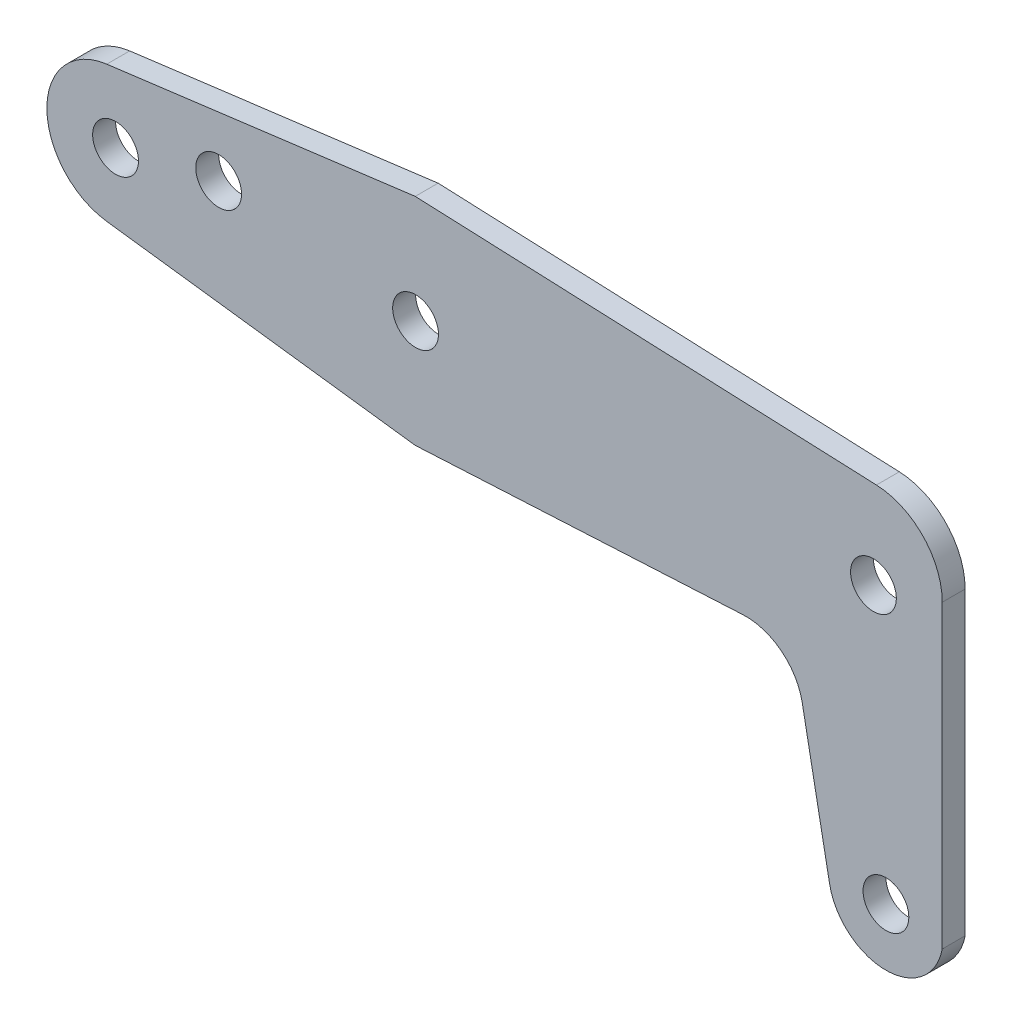
ISO-10303-21;
HEADER;
FILE_DESCRIPTION(('STEP AP214'),'2;1');
FILE_NAME('part.step','',(''),(''),'','','');
FILE_SCHEMA(('AUTOMOTIVE_DESIGN { 1 0 10303 214 1 1 1 1 }'));
ENDSEC;
DATA;
#1=APPLICATION_CONTEXT('core data for automotive mechanical design processes');
#2=APPLICATION_PROTOCOL_DEFINITION('international standard','automotive_design',2000,#1);
#3=PRODUCT_CONTEXT('',#1,'mechanical');
#4=PRODUCT('Part','Part','',(#3));
#5=PRODUCT_RELATED_PRODUCT_CATEGORY('part','',(#4));
#6=PRODUCT_DEFINITION_FORMATION('','',#4);
#7=PRODUCT_DEFINITION_CONTEXT('part definition',#1,'design');
#8=PRODUCT_DEFINITION('design','',#6,#7);
#9=PRODUCT_DEFINITION_SHAPE('','',#8);
#10=(LENGTH_UNIT() NAMED_UNIT(*) SI_UNIT(.MILLI.,.METRE.));
#11=(NAMED_UNIT(*) PLANE_ANGLE_UNIT() SI_UNIT($,.RADIAN.));
#12=(NAMED_UNIT(*) SI_UNIT($,.STERADIAN.) SOLID_ANGLE_UNIT());
#13=UNCERTAINTY_MEASURE_WITH_UNIT(LENGTH_MEASURE(1.E-05),#10,'distance_accuracy_value','');
#14=(GEOMETRIC_REPRESENTATION_CONTEXT(3) GLOBAL_UNCERTAINTY_ASSIGNED_CONTEXT((#13)) GLOBAL_UNIT_ASSIGNED_CONTEXT((#10,
#11,#12)) REPRESENTATION_CONTEXT('',''));
#15=CARTESIAN_POINT('',(0.,0.,0.));
#16=DIRECTION('',(0.,0.,1.));
#17=DIRECTION('',(1.,0.,0.));
#18=AXIS2_PLACEMENT_3D('',#15,#16,#17);
#19=CARTESIAN_POINT('',(-41.6068780105601,0.,3.175));
#20=DIRECTION('',(0.,0.,-1.));
#21=DIRECTION('',(-1.,0.,0.));
#22=AXIS2_PLACEMENT_3D('',#19,#20,#21);
#23=CYLINDRICAL_SURFACE('',#22,9.525);
#24=CARTESIAN_POINT('',(-41.6068780105601,0.,0.));
#25=DIRECTION('',(0.,0.,1.));
#26=DIRECTION('',(1.,0.,0.));
#27=AXIS2_PLACEMENT_3D('',#24,#25,#26);
#28=CIRCLE('',#27,9.525);
#29=CARTESIAN_POINT('',(-42.823231979609,9.44701582627969,0.));
#30=VERTEX_POINT('',#29);
#31=CARTESIAN_POINT('',(-42.823231979609,-9.4470158262797,0.));
#32=VERTEX_POINT('',#31);
#33=EDGE_CURVE('E156',#30,#32,#28,.T.);
#34=ORIENTED_EDGE('',*,*,#33,.T.);
#35=DIRECTION('',(0.,0.,-1.));
#36=VECTOR('',#35,1.);
#37=CARTESIAN_POINT('',(-42.823231979609,-9.4470158262797,3.175));
#38=LINE('',#37,#36);
#39=CARTESIAN_POINT('',(-42.823231979609,-9.4470158262797,3.175));
#40=VERTEX_POINT('',#39);
#41=EDGE_CURVE('E11',#40,#32,#38,.T.);
#42=ORIENTED_EDGE('',*,*,#41,.F.);
#43=CARTESIAN_POINT('',(-41.6068780105601,0.,3.175));
#44=DIRECTION('',(0.,0.,1.));
#45=DIRECTION('',(1.,0.,0.));
#46=AXIS2_PLACEMENT_3D('',#43,#44,#45);
#47=CIRCLE('',#46,9.525);
#48=CARTESIAN_POINT('',(-42.823231979609,9.44701582627969,3.175));
#49=VERTEX_POINT('',#48);
#50=EDGE_CURVE('E185',#49,#40,#47,.T.);
#51=ORIENTED_EDGE('',*,*,#50,.F.);
#52=DIRECTION('',(0.,0.,-1.));
#53=VECTOR('',#52,1.);
#54=CARTESIAN_POINT('',(-42.823231979609,9.44701582627969,3.175));
#55=LINE('',#54,#53);
#56=EDGE_CURVE('E152',#49,#30,#55,.T.);
#57=ORIENTED_EDGE('',*,*,#56,.T.);
#58=EDGE_LOOP('',(#34,#42,#51,#57));
#59=FACE_BOUND('',#58,.T.);
#60=ADVANCED_FACE('F43',(#59),#23,.T.);
#61=CARTESIAN_POINT('',(-42.823231979609,-9.4470158262797,3.175));
#62=DIRECTION('',(0.127701204099621,0.991812685173721,0.));
#63=DIRECTION('',(-0.991812685173721,0.127701204099621,0.));
#64=AXIS2_PLACEMENT_3D('',#61,#62,#63);
#65=PLANE('',#64);
#66=DIRECTION('',(0.991812685173721,-0.127701204099621,0.));
#67=VECTOR('',#66,1.);
#68=CARTESIAN_POINT('',(-42.823231979609,-9.4470158262797,0.));
#69=LINE('',#68,#67);
#70=CARTESIAN_POINT('',(-0.0462491693048968,-14.9547818533575,0.));
#71=VERTEX_POINT('',#70);
#72=EDGE_CURVE('E160',#32,#71,#69,.T.);
#73=ORIENTED_EDGE('',*,*,#72,.T.);
#74=DIRECTION('',(0.,0.,-1.));
#75=VECTOR('',#74,1.);
#76=CARTESIAN_POINT('',(-0.0462491693048968,-14.9547818533575,3.175));
#77=LINE('',#76,#75);
#78=CARTESIAN_POINT('',(-0.0462491693048968,-14.9547818533575,3.175));
#79=VERTEX_POINT('',#78);
#80=EDGE_CURVE('E52',#79,#71,#77,.T.);
#81=ORIENTED_EDGE('',*,*,#80,.F.);
#82=DIRECTION('',(0.991812685173721,-0.127701204099621,0.));
#83=VECTOR('',#82,1.);
#84=CARTESIAN_POINT('',(-42.823231979609,-9.4470158262797,3.175));
#85=LINE('',#84,#83);
#86=EDGE_CURVE('E109',#40,#79,#85,.T.);
#87=ORIENTED_EDGE('',*,*,#86,.F.);
#88=ORIENTED_EDGE('',*,*,#41,.T.);
#89=EDGE_LOOP('',(#73,#81,#87,#88));
#90=FACE_BOUND('',#89,.T.);
#91=ADVANCED_FACE('F323',(#90),#65,.F.);
#92=CARTESIAN_POINT('',(-0.0462491693048968,-14.9547818533575,3.175));
#93=DIRECTION('',(-0.0525125452653519,0.998620264459797,0.));
#94=DIRECTION('',(-0.998620264459797,-0.0525125452653519,0.));
#95=AXIS2_PLACEMENT_3D('',#92,#93,#94);
#96=PLANE('',#95);
#97=DIRECTION('',(0.998620264459797,0.0525125452653519,0.));
#98=VECTOR('',#97,1.);
#99=CARTESIAN_POINT('',(-0.0462491693048968,-14.9547818533575,0.));
#100=LINE('',#99,#98);
#101=CARTESIAN_POINT('',(45.3983126657175,-12.5650750795653,0.));
#102=VERTEX_POINT('',#101);
#103=EDGE_CURVE('E164',#71,#102,#100,.T.);
#104=ORIENTED_EDGE('',*,*,#103,.T.);
#105=DIRECTION('',(0.,0.,-1.));
#106=VECTOR('',#105,1.);
#107=CARTESIAN_POINT('',(45.3983126657175,-12.5650750795653,3.175));
#108=LINE('',#107,#106);
#109=CARTESIAN_POINT('',(45.3983126657175,-12.5650750795653,3.175));
#110=VERTEX_POINT('',#109);
#111=EDGE_CURVE('E204',#110,#102,#108,.T.);
#112=ORIENTED_EDGE('',*,*,#111,.F.);
#113=DIRECTION('',(0.998620264459797,0.0525125452653519,0.));
#114=VECTOR('',#113,1.);
#115=CARTESIAN_POINT('',(-0.0462491693048968,-14.9547818533575,3.175));
#116=LINE('',#115,#114);
#117=EDGE_CURVE('E214',#79,#110,#116,.T.);
#118=ORIENTED_EDGE('',*,*,#117,.F.);
#119=ORIENTED_EDGE('',*,*,#80,.T.);
#120=EDGE_LOOP('',(#104,#112,#118,#119));
#121=FACE_BOUND('',#120,.T.);
#122=ADVANCED_FACE('F212',(#121),#96,.F.);
#123=CARTESIAN_POINT('',(45.8157979030861,-20.5043059060736,3.175));
#124=DIRECTION('',(0.,0.,-1.));
#125=DIRECTION('',(-1.,0.,0.));
#126=AXIS2_PLACEMENT_3D('',#123,#124,#125);
#127=CYLINDRICAL_SURFACE('',#126,7.9502);
#128=CARTESIAN_POINT('',(45.8157979030861,-20.5043059060736,0.));
#129=DIRECTION('',(0.,0.,-1.));
#130=DIRECTION('',(-1.,0.,0.));
#131=AXIS2_PLACEMENT_3D('',#128,#129,#130);
#132=CIRCLE('',#131,7.9502);
#133=CARTESIAN_POINT('',(53.6248359675925,-19.0127950790625,0.));
#134=VERTEX_POINT('',#133);
#135=EDGE_CURVE('E167',#102,#134,#132,.T.);
#136=ORIENTED_EDGE('',*,*,#135,.T.);
#137=DIRECTION('',(0.,0.,-1.));
#138=VECTOR('',#137,1.);
#139=CARTESIAN_POINT('',(53.6248359675925,-19.0127950790625,3.175));
#140=LINE('',#139,#138);
#141=CARTESIAN_POINT('',(53.6248359675925,-19.0127950790625,3.175));
#142=VERTEX_POINT('',#141);
#143=EDGE_CURVE('E200',#142,#134,#140,.T.);
#144=ORIENTED_EDGE('',*,*,#143,.F.);
#145=CARTESIAN_POINT('',(45.8157979030861,-20.5043059060736,3.175));
#146=DIRECTION('',(0.,0.,-1.));
#147=DIRECTION('',(-1.,0.,0.));
#148=AXIS2_PLACEMENT_3D('',#145,#146,#147);
#149=CIRCLE('',#148,7.9502);
#150=EDGE_CURVE('E233',#110,#142,#149,.T.);
#151=ORIENTED_EDGE('',*,*,#150,.F.);
#152=ORIENTED_EDGE('',*,*,#111,.T.);
#153=EDGE_LOOP('',(#136,#144,#151,#152));
#154=FACE_BOUND('',#153,.T.);
#155=ADVANCED_FACE('F223',(#154),#127,.F.);
#156=CARTESIAN_POINT('',(53.6248359675925,-19.0127950790625,3.175));
#157=DIRECTION('',(0.982244228384986,0.187606705115735,0.));
#158=DIRECTION('',(-0.187606705115735,0.982244228384987,0.));
#159=AXIS2_PLACEMENT_3D('',#156,#157,#158);
#160=PLANE('',#159);
#161=DIRECTION('',(0.187606705115735,-0.982244228384986,0.));
#162=VECTOR('',#161,1.);
#163=CARTESIAN_POINT('',(53.6248359675925,-19.0127950790625,0.));
#164=LINE('',#163,#162);
#165=CARTESIAN_POINT('',(57.4220964213346,-38.8939457131071,0.));
#166=VERTEX_POINT('',#165);
#167=EDGE_CURVE('E170',#134,#166,#164,.T.);
#168=ORIENTED_EDGE('',*,*,#167,.T.);
#169=DIRECTION('',(0.,0.,-1.));
#170=VECTOR('',#169,1.);
#171=CARTESIAN_POINT('',(57.4220964213346,-38.8939457131071,3.175));
#172=LINE('',#171,#170);
#173=CARTESIAN_POINT('',(57.4220964213346,-38.8939457131071,3.175));
#174=VERTEX_POINT('',#173);
#175=EDGE_CURVE('E196',#174,#166,#172,.T.);
#176=ORIENTED_EDGE('',*,*,#175,.F.);
#177=DIRECTION('',(0.187606705115735,-0.982244228384986,0.));
#178=VECTOR('',#177,1.);
#179=CARTESIAN_POINT('',(53.6248359675925,-19.0127950790625,3.175));
#180=LINE('',#179,#178);
#181=EDGE_CURVE('E229',#142,#174,#180,.T.);
#182=ORIENTED_EDGE('',*,*,#181,.F.);
#183=ORIENTED_EDGE('',*,*,#143,.T.);
#184=EDGE_LOOP('',(#168,#176,#182,#183));
#185=FACE_BOUND('',#184,.T.);
#186=ADVANCED_FACE('F227',(#185),#160,.F.);
#187=CARTESIAN_POINT('',(65.2311344858409,-37.402434886096,3.175));
#188=DIRECTION('',(0.,0.,-1.));
#189=DIRECTION('',(-1.,0.,0.));
#190=AXIS2_PLACEMENT_3D('',#187,#188,#189);
#191=CYLINDRICAL_SURFACE('',#190,7.9502);
#192=CARTESIAN_POINT('',(65.2311344858409,-37.402434886096,0.));
#193=DIRECTION('',(0.,0.,1.));
#194=DIRECTION('',(1.,0.,0.));
#195=AXIS2_PLACEMENT_3D('',#192,#193,#194);
#196=CIRCLE('',#195,7.9502);
#197=CARTESIAN_POINT('',(73.0401725503472,-38.8939457131071,0.));
#198=VERTEX_POINT('',#197);
#199=EDGE_CURVE('E173',#166,#198,#196,.T.);
#200=ORIENTED_EDGE('',*,*,#199,.T.);
#201=DIRECTION('',(0.,0.,-1.));
#202=VECTOR('',#201,1.);
#203=CARTESIAN_POINT('',(73.0401725503472,-38.8939457131071,3.175));
#204=LINE('',#203,#202);
#205=CARTESIAN_POINT('',(73.0401725503472,-38.8939457131071,3.175));
#206=VERTEX_POINT('',#205);
#207=EDGE_CURVE('E192',#206,#198,#204,.T.);
#208=ORIENTED_EDGE('',*,*,#207,.F.);
#209=CARTESIAN_POINT('',(65.2311344858409,-37.402434886096,3.175));
#210=DIRECTION('',(0.,0.,1.));
#211=DIRECTION('',(1.,0.,0.));
#212=AXIS2_PLACEMENT_3D('',#209,#210,#211);
#213=CIRCLE('',#212,7.9502);
#214=EDGE_CURVE('E232',#174,#206,#213,.T.);
#215=ORIENTED_EDGE('',*,*,#214,.F.);
#216=ORIENTED_EDGE('',*,*,#175,.T.);
#217=EDGE_LOOP('',(#200,#208,#215,#216));
#218=FACE_BOUND('',#217,.T.);
#219=ADVANCED_FACE('F335',(#218),#191,.T.);
#220=CARTESIAN_POINT('',(73.0401725503472,-38.8939457131071,3.175));
#221=DIRECTION('',(-1.,0.,0.));
#222=DIRECTION('',(0.,0.,1.));
#223=AXIS2_PLACEMENT_3D('',#220,#221,#222);
#224=PLANE('',#223);
#225=DIRECTION('',(0.,1.,0.));
#226=VECTOR('',#225,1.);
#227=CARTESIAN_POINT('',(73.0401725503472,-38.8939457131071,0.));
#228=LINE('',#227,#226);
#229=CARTESIAN_POINT('',(73.0401725503472,2.75262483710328,0.));
#230=VERTEX_POINT('',#229);
#231=EDGE_CURVE('E176',#198,#230,#228,.T.);
#232=ORIENTED_EDGE('',*,*,#231,.T.);
#233=DIRECTION('',(0.,0.,-1.));
#234=VECTOR('',#233,1.);
#235=CARTESIAN_POINT('',(73.0401725503472,2.75262483710328,3.175));
#236=LINE('',#235,#234);
#237=CARTESIAN_POINT('',(73.0401725503472,2.75262483710328,3.175));
#238=VERTEX_POINT('',#237);
#239=EDGE_CURVE('E145',#238,#230,#236,.T.);
#240=ORIENTED_EDGE('',*,*,#239,.F.);
#241=DIRECTION('',(0.,1.,0.));
#242=VECTOR('',#241,1.);
#243=CARTESIAN_POINT('',(73.0401725503472,-38.8939457131071,3.175));
#244=LINE('',#243,#242);
#245=EDGE_CURVE('E134',#206,#238,#244,.T.);
#246=ORIENTED_EDGE('',*,*,#245,.F.);
#247=ORIENTED_EDGE('',*,*,#207,.T.);
#248=EDGE_LOOP('',(#232,#240,#246,#247));
#249=FACE_BOUND('',#248,.T.);
#250=ADVANCED_FACE('F332',(#249),#224,.F.);
#251=CARTESIAN_POINT('',(63.5151725503472,2.75262483710327,3.175));
#252=DIRECTION('',(0.,0.,-1.));
#253=DIRECTION('',(-1.,0.,0.));
#254=AXIS2_PLACEMENT_3D('',#251,#252,#253);
#255=CYLINDRICAL_SURFACE('',#254,9.525);
#256=CARTESIAN_POINT('',(63.5151725503472,2.75262483710327,0.));
#257=DIRECTION('',(0.,0.,1.));
#258=DIRECTION('',(-1.,0.,0.));
#259=AXIS2_PLACEMENT_3D('',#256,#257,#258);
#260=CIRCLE('',#259,9.525);
#261=CARTESIAN_POINT('',(63.9147483747233,12.2692400000997,0.));
#262=VERTEX_POINT('',#261);
#263=EDGE_CURVE('E143',#230,#262,#260,.T.);
#264=ORIENTED_EDGE('',*,*,#263,.T.);
#265=DIRECTION('',(0.,0.,-1.));
#266=VECTOR('',#265,1.);
#267=CARTESIAN_POINT('',(63.9147483747233,12.2692400000997,3.175));
#268=LINE('',#267,#266);
#269=CARTESIAN_POINT('',(63.9147483747233,12.2692400000997,3.175));
#270=VERTEX_POINT('',#269);
#271=EDGE_CURVE('E140',#270,#262,#268,.T.);
#272=ORIENTED_EDGE('',*,*,#271,.F.);
#273=CARTESIAN_POINT('',(63.5151725503472,2.75262483710327,3.175));
#274=DIRECTION('',(0.,0.,1.));
#275=DIRECTION('',(-1.,0.,0.));
#276=AXIS2_PLACEMENT_3D('',#273,#274,#275);
#277=CIRCLE('',#276,9.525);
#278=EDGE_CURVE('E128',#238,#270,#277,.T.);
#279=ORIENTED_EDGE('',*,*,#278,.F.);
#280=ORIENTED_EDGE('',*,*,#239,.T.);
#281=EDGE_LOOP('',(#264,#272,#279,#280));
#282=FACE_BOUND('',#281,.T.);
#283=ADVANCED_FACE('F141',(#282),#255,.T.);
#284=CARTESIAN_POINT('',(-0.0462491693049005,14.9547818533575,3.175));
#285=DIRECTION('',(-0.0419502177822702,-0.999119702151859,0.));
#286=DIRECTION('',(0.99911970215186,-0.0419502177822702,0.));
#287=AXIS2_PLACEMENT_3D('',#284,#285,#286);
#288=PLANE('',#287);
#289=DIRECTION('',(-0.999119702151859,0.0419502177822702,0.));
#290=VECTOR('',#289,1.);
#291=CARTESIAN_POINT('',(-0.0462491693049005,14.9547818533575,0.));
#292=LINE('',#291,#290);
#293=CARTESIAN_POINT('',(-0.0462491693049005,14.9547818533575,0.));
#294=VERTEX_POINT('',#293);
#295=EDGE_CURVE('E95',#262,#294,#292,.T.);
#296=ORIENTED_EDGE('',*,*,#295,.T.);
#297=DIRECTION('',(0.,0.,-1.));
#298=VECTOR('',#297,1.);
#299=CARTESIAN_POINT('',(-0.0462491693049005,14.9547818533575,3.175));
#300=LINE('',#299,#298);
#301=CARTESIAN_POINT('',(-0.0462491693049005,14.9547818533575,3.175));
#302=VERTEX_POINT('',#301);
#303=EDGE_CURVE('E146',#302,#294,#300,.T.);
#304=ORIENTED_EDGE('',*,*,#303,.F.);
#305=DIRECTION('',(-0.999119702151859,0.0419502177822702,0.));
#306=VECTOR('',#305,1.);
#307=CARTESIAN_POINT('',(-0.0462491693049005,14.9547818533575,3.175));
#308=LINE('',#307,#306);
#309=EDGE_CURVE('E132',#270,#302,#308,.T.);
#310=ORIENTED_EDGE('',*,*,#309,.F.);
#311=ORIENTED_EDGE('',*,*,#271,.T.);
#312=EDGE_LOOP('',(#296,#304,#310,#311));
#313=FACE_BOUND('',#312,.T.);
#314=ADVANCED_FACE('F148',(#313),#288,.F.);
#315=CARTESIAN_POINT('',(-42.823231979609,9.44701582627969,3.175));
#316=DIRECTION('',(0.127701204099621,-0.991812685173721,0.));
#317=DIRECTION('',(0.991812685173721,0.127701204099621,0.));
#318=AXIS2_PLACEMENT_3D('',#315,#316,#317);
#319=PLANE('',#318);
#320=DIRECTION('',(-0.991812685173721,-0.127701204099621,0.));
#321=VECTOR('',#320,1.);
#322=CARTESIAN_POINT('',(-42.823231979609,9.44701582627969,0.));
#323=LINE('',#322,#321);
#324=EDGE_CURVE('E101',#294,#30,#323,.T.);
#325=ORIENTED_EDGE('',*,*,#324,.T.);
#326=ORIENTED_EDGE('',*,*,#56,.F.);
#327=DIRECTION('',(-0.991812685173721,-0.127701204099621,0.));
#328=VECTOR('',#327,1.);
#329=CARTESIAN_POINT('',(-42.823231979609,9.44701582627969,3.175));
#330=LINE('',#329,#328);
#331=EDGE_CURVE('E60',#302,#49,#330,.T.);
#332=ORIENTED_EDGE('',*,*,#331,.F.);
#333=ORIENTED_EDGE('',*,*,#303,.T.);
#334=EDGE_LOOP('',(#325,#326,#332,#333));
#335=FACE_BOUND('',#334,.T.);
#336=ADVANCED_FACE('F298',(#335),#319,.F.);
#337=CARTESIAN_POINT('',(-41.6068780105601,0.,3.175));
#338=DIRECTION('',(0.,0.,1.));
#339=DIRECTION('',(1.,0.,0.));
#340=AXIS2_PLACEMENT_3D('',#337,#338,#339);
#341=PLANE('',#340);
#342=CARTESIAN_POINT('',(-41.6068780105601,0.,3.175));
#343=DIRECTION('',(0.,0.,1.));
#344=DIRECTION('',(1.,0.,0.));
#345=AXIS2_PLACEMENT_3D('',#342,#343,#344);
#346=CIRCLE('',#345,3.175);
#347=CARTESIAN_POINT('',(-38.4318780105601,0.,3.175));
#348=VERTEX_POINT('',#347);
#349=EDGE_CURVE('E279',#348,#348,#346,.T.);
#350=ORIENTED_EDGE('',*,*,#349,.F.);
#351=EDGE_LOOP('',(#350));
#352=FACE_BOUND('',#351,.T.);
#353=CARTESIAN_POINT('',(-27.3066780105601,3.175,3.175));
#354=DIRECTION('',(0.,0.,1.));
#355=DIRECTION('',(1.,0.,0.));
#356=AXIS2_PLACEMENT_3D('',#353,#354,#355);
#357=CIRCLE('',#356,3.175);
#358=CARTESIAN_POINT('',(-24.1316780105601,3.175,3.175));
#359=VERTEX_POINT('',#358);
#360=EDGE_CURVE('E275',#359,#359,#357,.T.);
#361=ORIENTED_EDGE('',*,*,#360,.F.);
#362=EDGE_LOOP('',(#361));
#363=FACE_BOUND('',#362,.T.);
#364=CARTESIAN_POINT('',(0.,0.,3.175));
#365=DIRECTION('',(0.,0.,1.));
#366=DIRECTION('',(1.,0.,0.));
#367=AXIS2_PLACEMENT_3D('',#364,#365,#366);
#368=CIRCLE('',#367,3.175);
#369=CARTESIAN_POINT('',(3.175,0.,3.175));
#370=VERTEX_POINT('',#369);
#371=EDGE_CURVE('E267',#370,#370,#368,.T.);
#372=ORIENTED_EDGE('',*,*,#371,.F.);
#373=EDGE_LOOP('',(#372));
#374=FACE_BOUND('',#373,.T.);
#375=CARTESIAN_POINT('',(63.5,0.0372049209374781,3.175));
#376=DIRECTION('',(0.,0.,1.));
#377=DIRECTION('',(1.,0.,0.));
#378=AXIS2_PLACEMENT_3D('',#375,#376,#377);
#379=CIRCLE('',#378,3.175);
#380=CARTESIAN_POINT('',(66.675,0.0372049209374781,3.175));
#381=VERTEX_POINT('',#380);
#382=EDGE_CURVE('E259',#381,#381,#379,.T.);
#383=ORIENTED_EDGE('',*,*,#382,.F.);
#384=EDGE_LOOP('',(#383));
#385=FACE_BOUND('',#384,.T.);
#386=CARTESIAN_POINT('',(65.2311344858409,-37.402434886096,3.175));
#387=DIRECTION('',(0.,0.,1.));
#388=DIRECTION('',(1.,0.,0.));
#389=AXIS2_PLACEMENT_3D('',#386,#387,#388);
#390=CIRCLE('',#389,3.175);
#391=CARTESIAN_POINT('',(68.4061344858409,-37.402434886096,3.175));
#392=VERTEX_POINT('',#391);
#393=EDGE_CURVE('E251',#392,#392,#390,.T.);
#394=ORIENTED_EDGE('',*,*,#393,.F.);
#395=EDGE_LOOP('',(#394));
#396=FACE_BOUND('',#395,.T.);
#397=ORIENTED_EDGE('',*,*,#50,.T.);
#398=ORIENTED_EDGE('',*,*,#86,.T.);
#399=ORIENTED_EDGE('',*,*,#117,.T.);
#400=ORIENTED_EDGE('',*,*,#150,.T.);
#401=ORIENTED_EDGE('',*,*,#181,.T.);
#402=ORIENTED_EDGE('',*,*,#214,.T.);
#403=ORIENTED_EDGE('',*,*,#245,.T.);
#404=ORIENTED_EDGE('',*,*,#278,.T.);
#405=ORIENTED_EDGE('',*,*,#309,.T.);
#406=ORIENTED_EDGE('',*,*,#331,.T.);
#407=EDGE_LOOP('',(#397,#398,#399,#400,#401,#402,#403,#404,#405,#406));
#408=FACE_BOUND('',#407,.T.);
#409=ADVANCED_FACE('F130',(#352,#363,#374,#385,#396,#408),#341,.T.);
#410=CARTESIAN_POINT('',(-41.6068780105601,0.,0.));
#411=DIRECTION('',(0.,0.,1.));
#412=DIRECTION('',(1.,0.,0.));
#413=AXIS2_PLACEMENT_3D('',#410,#411,#412);
#414=PLANE('',#413);
#415=CARTESIAN_POINT('',(-41.6068780105601,0.,0.));
#416=DIRECTION('',(0.,0.,1.));
#417=DIRECTION('',(1.,0.,0.));
#418=AXIS2_PLACEMENT_3D('',#415,#416,#417);
#419=CIRCLE('',#418,3.175);
#420=CARTESIAN_POINT('',(-38.4318780105601,0.,0.));
#421=VERTEX_POINT('',#420);
#422=EDGE_CURVE('E161',#421,#421,#419,.T.);
#423=ORIENTED_EDGE('',*,*,#422,.T.);
#424=EDGE_LOOP('',(#423));
#425=FACE_BOUND('',#424,.T.);
#426=CARTESIAN_POINT('',(-27.3066780105601,3.175,0.));
#427=DIRECTION('',(0.,0.,1.));
#428=DIRECTION('',(1.,0.,0.));
#429=AXIS2_PLACEMENT_3D('',#426,#427,#428);
#430=CIRCLE('',#429,3.175);
#431=CARTESIAN_POINT('',(-24.1316780105601,3.175,0.));
#432=VERTEX_POINT('',#431);
#433=EDGE_CURVE('E271',#432,#432,#430,.T.);
#434=ORIENTED_EDGE('',*,*,#433,.T.);
#435=EDGE_LOOP('',(#434));
#436=FACE_BOUND('',#435,.T.);
#437=CARTESIAN_POINT('',(0.,0.,0.));
#438=DIRECTION('',(0.,0.,1.));
#439=DIRECTION('',(1.,0.,0.));
#440=AXIS2_PLACEMENT_3D('',#437,#438,#439);
#441=CIRCLE('',#440,3.175);
#442=CARTESIAN_POINT('',(3.175,0.,0.));
#443=VERTEX_POINT('',#442);
#444=EDGE_CURVE('E263',#443,#443,#441,.T.);
#445=ORIENTED_EDGE('',*,*,#444,.T.);
#446=EDGE_LOOP('',(#445));
#447=FACE_BOUND('',#446,.T.);
#448=CARTESIAN_POINT('',(63.5,0.0372049209374781,0.));
#449=DIRECTION('',(0.,0.,1.));
#450=DIRECTION('',(1.,0.,0.));
#451=AXIS2_PLACEMENT_3D('',#448,#449,#450);
#452=CIRCLE('',#451,3.175);
#453=CARTESIAN_POINT('',(66.675,0.0372049209374781,0.));
#454=VERTEX_POINT('',#453);
#455=EDGE_CURVE('E255',#454,#454,#452,.T.);
#456=ORIENTED_EDGE('',*,*,#455,.T.);
#457=EDGE_LOOP('',(#456));
#458=FACE_BOUND('',#457,.T.);
#459=CARTESIAN_POINT('',(65.2311344858409,-37.402434886096,0.));
#460=DIRECTION('',(0.,0.,1.));
#461=DIRECTION('',(1.,0.,0.));
#462=AXIS2_PLACEMENT_3D('',#459,#460,#461);
#463=CIRCLE('',#462,3.175);
#464=CARTESIAN_POINT('',(68.4061344858409,-37.402434886096,0.));
#465=VERTEX_POINT('',#464);
#466=EDGE_CURVE('E247',#465,#465,#463,.T.);
#467=ORIENTED_EDGE('',*,*,#466,.T.);
#468=EDGE_LOOP('',(#467));
#469=FACE_BOUND('',#468,.T.);
#470=ORIENTED_EDGE('',*,*,#33,.F.);
#471=ORIENTED_EDGE('',*,*,#324,.F.);
#472=ORIENTED_EDGE('',*,*,#295,.F.);
#473=ORIENTED_EDGE('',*,*,#263,.F.);
#474=ORIENTED_EDGE('',*,*,#231,.F.);
#475=ORIENTED_EDGE('',*,*,#199,.F.);
#476=ORIENTED_EDGE('',*,*,#167,.F.);
#477=ORIENTED_EDGE('',*,*,#135,.F.);
#478=ORIENTED_EDGE('',*,*,#103,.F.);
#479=ORIENTED_EDGE('',*,*,#72,.F.);
#480=EDGE_LOOP('',(#470,#471,#472,#473,#474,#475,#476,#477,#478,#479));
#481=FACE_BOUND('',#480,.T.);
#482=ADVANCED_FACE('F218',(#425,#436,#447,#458,#469,#481),#414,.F.);
#483=CARTESIAN_POINT('',(65.2311344858409,-37.402434886096,0.));
#484=DIRECTION('',(0.,0.,1.));
#485=DIRECTION('',(1.,0.,0.));
#486=AXIS2_PLACEMENT_3D('',#483,#484,#485);
#487=CYLINDRICAL_SURFACE('',#486,3.175);
#488=ORIENTED_EDGE('',*,*,#466,.F.);
#489=EDGE_LOOP('',(#488));
#490=FACE_BOUND('',#489,.T.);
#491=ORIENTED_EDGE('',*,*,#393,.T.);
#492=EDGE_LOOP('',(#491));
#493=FACE_BOUND('',#492,.T.);
#494=ADVANCED_FACE('F308',(#490,#493),#487,.F.);
#495=CARTESIAN_POINT('',(63.5,0.0372049209374781,0.));
#496=DIRECTION('',(0.,0.,1.));
#497=DIRECTION('',(1.,0.,0.));
#498=AXIS2_PLACEMENT_3D('',#495,#496,#497);
#499=CYLINDRICAL_SURFACE('',#498,3.175);
#500=ORIENTED_EDGE('',*,*,#455,.F.);
#501=EDGE_LOOP('',(#500));
#502=FACE_BOUND('',#501,.T.);
#503=ORIENTED_EDGE('',*,*,#382,.T.);
#504=EDGE_LOOP('',(#503));
#505=FACE_BOUND('',#504,.T.);
#506=ADVANCED_FACE('F310',(#502,#505),#499,.F.);
#507=CARTESIAN_POINT('',(0.,0.,0.));
#508=DIRECTION('',(0.,0.,1.));
#509=DIRECTION('',(1.,0.,0.));
#510=AXIS2_PLACEMENT_3D('',#507,#508,#509);
#511=CYLINDRICAL_SURFACE('',#510,3.175);
#512=ORIENTED_EDGE('',*,*,#444,.F.);
#513=EDGE_LOOP('',(#512));
#514=FACE_BOUND('',#513,.T.);
#515=ORIENTED_EDGE('',*,*,#371,.T.);
#516=EDGE_LOOP('',(#515));
#517=FACE_BOUND('',#516,.T.);
#518=ADVANCED_FACE('F317',(#514,#517),#511,.F.);
#519=CARTESIAN_POINT('',(-27.3066780105601,3.175,0.));
#520=DIRECTION('',(0.,0.,1.));
#521=DIRECTION('',(1.,0.,0.));
#522=AXIS2_PLACEMENT_3D('',#519,#520,#521);
#523=CYLINDRICAL_SURFACE('',#522,3.175);
#524=ORIENTED_EDGE('',*,*,#433,.F.);
#525=EDGE_LOOP('',(#524));
#526=FACE_BOUND('',#525,.T.);
#527=ORIENTED_EDGE('',*,*,#360,.T.);
#528=EDGE_LOOP('',(#527));
#529=FACE_BOUND('',#528,.T.);
#530=ADVANCED_FACE('F292',(#526,#529),#523,.F.);
#531=CARTESIAN_POINT('',(-41.6068780105601,0.,0.));
#532=DIRECTION('',(0.,0.,1.));
#533=DIRECTION('',(1.,0.,0.));
#534=AXIS2_PLACEMENT_3D('',#531,#532,#533);
#535=CYLINDRICAL_SURFACE('',#534,3.175);
#536=ORIENTED_EDGE('',*,*,#422,.F.);
#537=EDGE_LOOP('',(#536));
#538=FACE_BOUND('',#537,.T.);
#539=ORIENTED_EDGE('',*,*,#349,.T.);
#540=EDGE_LOOP('',(#539));
#541=FACE_BOUND('',#540,.T.);
#542=ADVANCED_FACE('F289',(#538,#541),#535,.F.);
#543=CLOSED_SHELL('',(#60,#91,#122,#155,#186,#219,#250,#283,#314,#336,#409,#482,#494,#506,#518,
#530,#542));
#544=MANIFOLD_SOLID_BREP('B2',#543);
#545=ADVANCED_BREP_SHAPE_REPRESENTATION('',(#18,#544),#14);
#546=SHAPE_DEFINITION_REPRESENTATION(#9,#545);
ENDSEC;
END-ISO-10303-21;
